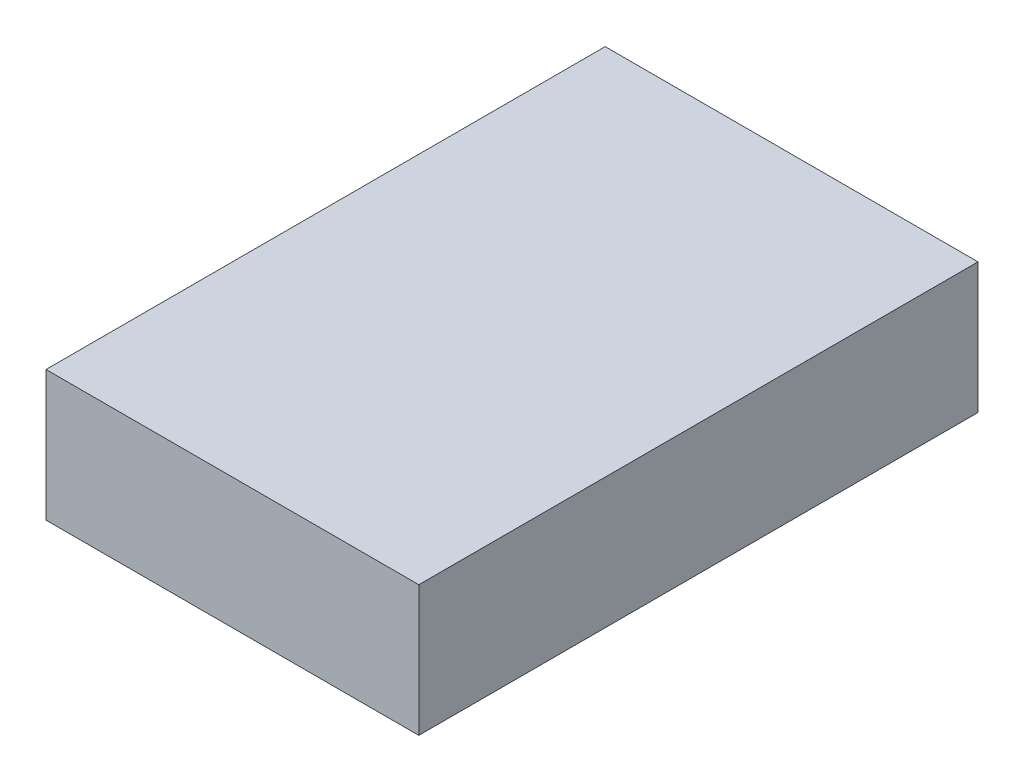
ISO-10303-21;
HEADER;
FILE_DESCRIPTION(('STEP AP214'),'2;1');
FILE_NAME('part.step','',(''),(''),'','','');
FILE_SCHEMA(('AUTOMOTIVE_DESIGN { 1 0 10303 214 1 1 1 1 }'));
ENDSEC;
DATA;
#1=APPLICATION_CONTEXT('core data for automotive mechanical design processes');
#2=APPLICATION_PROTOCOL_DEFINITION('international standard','automotive_design',2000,#1);
#3=PRODUCT_CONTEXT('',#1,'mechanical');
#4=PRODUCT('Part','Part','',(#3));
#5=PRODUCT_RELATED_PRODUCT_CATEGORY('part','',(#4));
#6=PRODUCT_DEFINITION_FORMATION('','',#4);
#7=PRODUCT_DEFINITION_CONTEXT('part definition',#1,'design');
#8=PRODUCT_DEFINITION('design','',#6,#7);
#9=PRODUCT_DEFINITION_SHAPE('','',#8);
#10=(LENGTH_UNIT() NAMED_UNIT(*) SI_UNIT(.MILLI.,.METRE.));
#11=(NAMED_UNIT(*) PLANE_ANGLE_UNIT() SI_UNIT($,.RADIAN.));
#12=(NAMED_UNIT(*) SI_UNIT($,.STERADIAN.) SOLID_ANGLE_UNIT());
#13=UNCERTAINTY_MEASURE_WITH_UNIT(LENGTH_MEASURE(1.E-05),#10,'distance_accuracy_value','');
#14=(GEOMETRIC_REPRESENTATION_CONTEXT(3) GLOBAL_UNCERTAINTY_ASSIGNED_CONTEXT((#13)) GLOBAL_UNIT_ASSIGNED_CONTEXT((#10,
#11,#12)) REPRESENTATION_CONTEXT('',''));
#15=CARTESIAN_POINT('',(0.,0.,0.));
#16=DIRECTION('',(0.,0.,1.));
#17=DIRECTION('',(1.,0.,0.));
#18=AXIS2_PLACEMENT_3D('',#15,#16,#17);
#19=CARTESIAN_POINT('',(0.,0.,300.));
#20=DIRECTION('',(1.,0.,0.));
#21=DIRECTION('',(0.,1.,0.));
#22=AXIS2_PLACEMENT_3D('',#19,#20,#21);
#23=PLANE('',#22);
#24=DIRECTION('',(0.,-1.,0.));
#25=VECTOR('',#24,1.);
#26=CARTESIAN_POINT('',(0.,0.,0.));
#27=LINE('',#26,#25);
#28=CARTESIAN_POINT('',(0.,70.,0.));
#29=VERTEX_POINT('',#28);
#30=CARTESIAN_POINT('',(0.,0.,0.));
#31=VERTEX_POINT('',#30);
#32=EDGE_CURVE('E96',#29,#31,#27,.T.);
#33=ORIENTED_EDGE('',*,*,#32,.T.);
#34=DIRECTION('',(0.,0.,-1.));
#35=VECTOR('',#34,1.);
#36=CARTESIAN_POINT('',(0.,0.,300.));
#37=LINE('',#36,#35);
#38=CARTESIAN_POINT('',(0.,0.,300.));
#39=VERTEX_POINT('',#38);
#40=EDGE_CURVE('E11',#39,#31,#37,.T.);
#41=ORIENTED_EDGE('',*,*,#40,.F.);
#42=DIRECTION('',(0.,-1.,0.));
#43=VECTOR('',#42,1.);
#44=CARTESIAN_POINT('',(0.,0.,300.));
#45=LINE('',#44,#43);
#46=CARTESIAN_POINT('',(0.,70.,300.));
#47=VERTEX_POINT('',#46);
#48=EDGE_CURVE('E84',#47,#39,#45,.T.);
#49=ORIENTED_EDGE('',*,*,#48,.F.);
#50=DIRECTION('',(0.,0.,-1.));
#51=VECTOR('',#50,1.);
#52=CARTESIAN_POINT('',(0.,70.,300.));
#53=LINE('',#52,#51);
#54=EDGE_CURVE('E92',#47,#29,#53,.T.);
#55=ORIENTED_EDGE('',*,*,#54,.T.);
#56=EDGE_LOOP('',(#33,#41,#49,#55));
#57=FACE_BOUND('',#56,.T.);
#58=ADVANCED_FACE('F33',(#57),#23,.F.);
#59=CARTESIAN_POINT('',(0.,0.,300.));
#60=DIRECTION('',(0.,1.,0.));
#61=DIRECTION('',(0.,0.,1.));
#62=AXIS2_PLACEMENT_3D('',#59,#60,#61);
#63=PLANE('',#62);
#64=DIRECTION('',(1.,0.,0.));
#65=VECTOR('',#64,1.);
#66=CARTESIAN_POINT('',(0.,0.,0.));
#67=LINE('',#66,#65);
#68=CARTESIAN_POINT('',(200.,0.,0.));
#69=VERTEX_POINT('',#68);
#70=EDGE_CURVE('E88',#31,#69,#67,.T.);
#71=ORIENTED_EDGE('',*,*,#70,.T.);
#72=DIRECTION('',(0.,0.,-1.));
#73=VECTOR('',#72,1.);
#74=CARTESIAN_POINT('',(200.,0.,300.));
#75=LINE('',#74,#73);
#76=CARTESIAN_POINT('',(200.,0.,300.));
#77=VERTEX_POINT('',#76);
#78=EDGE_CURVE('E41',#77,#69,#75,.T.);
#79=ORIENTED_EDGE('',*,*,#78,.F.);
#80=DIRECTION('',(1.,0.,0.));
#81=VECTOR('',#80,1.);
#82=CARTESIAN_POINT('',(0.,0.,300.));
#83=LINE('',#82,#81);
#84=EDGE_CURVE('E79',#39,#77,#83,.T.);
#85=ORIENTED_EDGE('',*,*,#84,.F.);
#86=ORIENTED_EDGE('',*,*,#40,.T.);
#87=EDGE_LOOP('',(#71,#79,#85,#86));
#88=FACE_BOUND('',#87,.T.);
#89=ADVANCED_FACE('F87',(#88),#63,.F.);
#90=CARTESIAN_POINT('',(200.,0.,300.));
#91=DIRECTION('',(-1.,0.,0.));
#92=DIRECTION('',(0.,0.,1.));
#93=AXIS2_PLACEMENT_3D('',#90,#91,#92);
#94=PLANE('',#93);
#95=DIRECTION('',(0.,1.,0.));
#96=VECTOR('',#95,1.);
#97=CARTESIAN_POINT('',(200.,0.,0.));
#98=LINE('',#97,#96);
#99=CARTESIAN_POINT('',(200.,70.,0.));
#100=VERTEX_POINT('',#99);
#101=EDGE_CURVE('E66',#69,#100,#98,.T.);
#102=ORIENTED_EDGE('',*,*,#101,.T.);
#103=DIRECTION('',(0.,0.,-1.));
#104=VECTOR('',#103,1.);
#105=CARTESIAN_POINT('',(200.,70.,300.));
#106=LINE('',#105,#104);
#107=CARTESIAN_POINT('',(200.,70.,300.));
#108=VERTEX_POINT('',#107);
#109=EDGE_CURVE('E89',#108,#100,#106,.T.);
#110=ORIENTED_EDGE('',*,*,#109,.F.);
#111=DIRECTION('',(0.,1.,0.));
#112=VECTOR('',#111,1.);
#113=CARTESIAN_POINT('',(200.,0.,300.));
#114=LINE('',#113,#112);
#115=EDGE_CURVE('E82',#77,#108,#114,.T.);
#116=ORIENTED_EDGE('',*,*,#115,.F.);
#117=ORIENTED_EDGE('',*,*,#78,.T.);
#118=EDGE_LOOP('',(#102,#110,#116,#117));
#119=FACE_BOUND('',#118,.T.);
#120=ADVANCED_FACE('F90',(#119),#94,.F.);
#121=CARTESIAN_POINT('',(0.,70.,300.));
#122=DIRECTION('',(0.,-1.,0.));
#123=DIRECTION('',(1.,0.,0.));
#124=AXIS2_PLACEMENT_3D('',#121,#122,#123);
#125=PLANE('',#124);
#126=DIRECTION('',(-1.,0.,0.));
#127=VECTOR('',#126,1.);
#128=CARTESIAN_POINT('',(0.,70.,0.));
#129=LINE('',#128,#127);
#130=EDGE_CURVE('E72',#100,#29,#129,.T.);
#131=ORIENTED_EDGE('',*,*,#130,.T.);
#132=ORIENTED_EDGE('',*,*,#54,.F.);
#133=DIRECTION('',(-1.,0.,0.));
#134=VECTOR('',#133,1.);
#135=CARTESIAN_POINT('',(0.,70.,300.));
#136=LINE('',#135,#134);
#137=EDGE_CURVE('E49',#108,#47,#136,.T.);
#138=ORIENTED_EDGE('',*,*,#137,.F.);
#139=ORIENTED_EDGE('',*,*,#109,.T.);
#140=EDGE_LOOP('',(#131,#132,#138,#139));
#141=FACE_BOUND('',#140,.T.);
#142=ADVANCED_FACE('F103',(#141),#125,.F.);
#143=CARTESIAN_POINT('',(0.,0.,300.));
#144=DIRECTION('',(0.,0.,-1.));
#145=DIRECTION('',(-1.,0.,0.));
#146=AXIS2_PLACEMENT_3D('',#143,#144,#145);
#147=PLANE('',#146);
#148=ORIENTED_EDGE('',*,*,#48,.T.);
#149=ORIENTED_EDGE('',*,*,#84,.T.);
#150=ORIENTED_EDGE('',*,*,#115,.T.);
#151=ORIENTED_EDGE('',*,*,#137,.T.);
#152=EDGE_LOOP('',(#148,#149,#150,#151));
#153=FACE_BOUND('',#152,.T.);
#154=ADVANCED_FACE('F80',(#153),#147,.F.);
#155=CARTESIAN_POINT('',(0.,0.,0.));
#156=DIRECTION('',(0.,0.,-1.));
#157=DIRECTION('',(-1.,0.,0.));
#158=AXIS2_PLACEMENT_3D('',#155,#156,#157);
#159=PLANE('',#158);
#160=ORIENTED_EDGE('',*,*,#32,.F.);
#161=ORIENTED_EDGE('',*,*,#130,.F.);
#162=ORIENTED_EDGE('',*,*,#101,.F.);
#163=ORIENTED_EDGE('',*,*,#70,.F.);
#164=EDGE_LOOP('',(#160,#161,#162,#163));
#165=FACE_BOUND('',#164,.T.);
#166=ADVANCED_FACE('F106',(#165),#159,.T.);
#167=CLOSED_SHELL('',(#58,#89,#120,#142,#154,#166));
#168=MANIFOLD_SOLID_BREP('B2',#167);
#169=ADVANCED_BREP_SHAPE_REPRESENTATION('',(#18,#168),#14);
#170=SHAPE_DEFINITION_REPRESENTATION(#9,#169);
ENDSEC;
END-ISO-10303-21;
